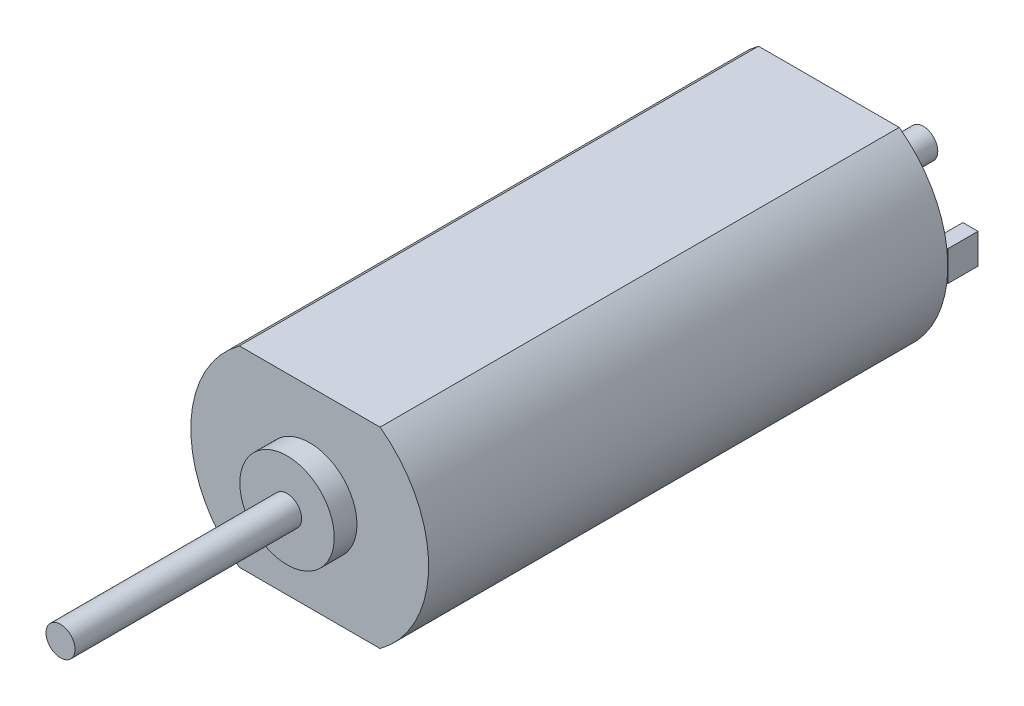
ISO-10303-21;
HEADER;
FILE_DESCRIPTION(('STEP AP214'),'2;1');
FILE_NAME('part.step','',(''),(''),'','','');
FILE_SCHEMA(('AUTOMOTIVE_DESIGN { 1 0 10303 214 1 1 1 1 }'));
ENDSEC;
DATA;
#1=APPLICATION_CONTEXT('core data for automotive mechanical design processes');
#2=APPLICATION_PROTOCOL_DEFINITION('international standard','automotive_design',2000,#1);
#3=PRODUCT_CONTEXT('',#1,'mechanical');
#4=PRODUCT('Part','Part','',(#3));
#5=PRODUCT_RELATED_PRODUCT_CATEGORY('part','',(#4));
#6=PRODUCT_DEFINITION_FORMATION('','',#4);
#7=PRODUCT_DEFINITION_CONTEXT('part definition',#1,'design');
#8=PRODUCT_DEFINITION('design','',#6,#7);
#9=PRODUCT_DEFINITION_SHAPE('','',#8);
#10=(LENGTH_UNIT() NAMED_UNIT(*) SI_UNIT(.MILLI.,.METRE.));
#11=(NAMED_UNIT(*) PLANE_ANGLE_UNIT() SI_UNIT($,.RADIAN.));
#12=(NAMED_UNIT(*) SI_UNIT($,.STERADIAN.) SOLID_ANGLE_UNIT());
#13=UNCERTAINTY_MEASURE_WITH_UNIT(LENGTH_MEASURE(1.E-05),#10,'distance_accuracy_value','');
#14=(GEOMETRIC_REPRESENTATION_CONTEXT(3) GLOBAL_UNCERTAINTY_ASSIGNED_CONTEXT((#13)) GLOBAL_UNIT_ASSIGNED_CONTEXT((#10,
#11,#12)) REPRESENTATION_CONTEXT('',''));
#15=CARTESIAN_POINT('',(0.,0.,0.));
#16=DIRECTION('',(0.,0.,1.));
#17=DIRECTION('',(1.,0.,0.));
#18=AXIS2_PLACEMENT_3D('',#15,#16,#17);
#19=CARTESIAN_POINT('',(0.,0.,0.));
#20=DIRECTION('',(0.,0.,1.));
#21=DIRECTION('',(1.,0.,0.));
#22=AXIS2_PLACEMENT_3D('',#19,#20,#21);
#23=PLANE('',#22);
#24=CARTESIAN_POINT('',(0.,0.,0.));
#25=DIRECTION('',(0.,0.,1.));
#26=DIRECTION('',(1.,0.,0.));
#27=AXIS2_PLACEMENT_3D('',#24,#25,#26);
#28=CIRCLE('',#27,0.9779);
#29=CARTESIAN_POINT('',(0.9779,0.,0.));
#30=VERTEX_POINT('',#29);
#31=EDGE_CURVE('E43',#30,#30,#28,.F.);
#32=ORIENTED_EDGE('',*,*,#31,.F.);
#33=EDGE_LOOP('',(#32));
#34=FACE_BOUND('',#33,.T.);
#35=DIRECTION('',(-1.,0.,0.));
#36=VECTOR('',#35,1.);
#37=CARTESIAN_POINT('',(-6.985,-1.016,0.));
#38=LINE('',#37,#36);
#39=CARTESIAN_POINT('',(-6.985,-1.016,0.));
#40=VERTEX_POINT('',#39);
#41=CARTESIAN_POINT('',(-7.93522173603233,-1.016,0.));
#42=VERTEX_POINT('',#41);
#43=EDGE_CURVE('E50',#40,#42,#38,.T.);
#44=ORIENTED_EDGE('',*,*,#43,.F.);
#45=DIRECTION('',(0.,-1.,0.));
#46=VECTOR('',#45,1.);
#47=CARTESIAN_POINT('',(-6.985,1.016,0.));
#48=LINE('',#47,#46);
#49=CARTESIAN_POINT('',(-6.985,1.016,0.));
#50=VERTEX_POINT('',#49);
#51=EDGE_CURVE('E157',#50,#40,#48,.T.);
#52=ORIENTED_EDGE('',*,*,#51,.F.);
#53=DIRECTION('',(1.,0.,0.));
#54=VECTOR('',#53,1.);
#55=CARTESIAN_POINT('',(-6.985,1.016,0.));
#56=LINE('',#55,#54);
#57=CARTESIAN_POINT('',(-7.93522173603233,1.016,0.));
#58=VERTEX_POINT('',#57);
#59=EDGE_CURVE('E254',#58,#50,#56,.T.);
#60=ORIENTED_EDGE('',*,*,#59,.F.);
#61=CARTESIAN_POINT('',(0.,0.,0.));
#62=DIRECTION('',(0.,0.,1.));
#63=DIRECTION('',(1.,0.,0.));
#64=AXIS2_PLACEMENT_3D('',#61,#62,#63);
#65=CIRCLE('',#64,8.);
#66=CARTESIAN_POINT('',(-4.73259970840552,6.45,0.));
#67=VERTEX_POINT('',#66);
#68=EDGE_CURVE('E224',#67,#58,#65,.T.);
#69=ORIENTED_EDGE('',*,*,#68,.F.);
#70=DIRECTION('',(1.,0.,0.));
#71=VECTOR('',#70,1.);
#72=CARTESIAN_POINT('',(0.,6.45,0.));
#73=LINE('',#72,#71);
#74=CARTESIAN_POINT('',(4.73259970840552,6.45,0.));
#75=VERTEX_POINT('',#74);
#76=EDGE_CURVE('E208',#67,#75,#73,.T.);
#77=ORIENTED_EDGE('',*,*,#76,.T.);
#78=CARTESIAN_POINT('',(7.93522173603233,1.016,0.));
#79=VERTEX_POINT('',#78);
#80=EDGE_CURVE('E231',#79,#75,#65,.T.);
#81=ORIENTED_EDGE('',*,*,#80,.F.);
#82=DIRECTION('',(1.,0.,0.));
#83=VECTOR('',#82,1.);
#84=CARTESIAN_POINT('',(8.001,1.016,0.));
#85=LINE('',#84,#83);
#86=CARTESIAN_POINT('',(6.985,1.016,0.));
#87=VERTEX_POINT('',#86);
#88=EDGE_CURVE('E171',#87,#79,#85,.T.);
#89=ORIENTED_EDGE('',*,*,#88,.F.);
#90=DIRECTION('',(0.,1.,0.));
#91=VECTOR('',#90,1.);
#92=CARTESIAN_POINT('',(6.985,1.016,0.));
#93=LINE('',#92,#91);
#94=CARTESIAN_POINT('',(6.985,-1.016,0.));
#95=VERTEX_POINT('',#94);
#96=EDGE_CURVE('E58',#95,#87,#93,.T.);
#97=ORIENTED_EDGE('',*,*,#96,.F.);
#98=DIRECTION('',(-1.,0.,0.));
#99=VECTOR('',#98,1.);
#100=CARTESIAN_POINT('',(0.,-1.016,0.));
#101=LINE('',#100,#99);
#102=CARTESIAN_POINT('',(7.93522173603233,-1.016,0.));
#103=VERTEX_POINT('',#102);
#104=EDGE_CURVE('E11',#103,#95,#101,.T.);
#105=ORIENTED_EDGE('',*,*,#104,.F.);
#106=CARTESIAN_POINT('',(4.73259970840552,-6.45,0.));
#107=VERTEX_POINT('',#106);
#108=EDGE_CURVE('E215',#107,#103,#65,.T.);
#109=ORIENTED_EDGE('',*,*,#108,.F.);
#110=DIRECTION('',(-1.,0.,0.));
#111=VECTOR('',#110,1.);
#112=CARTESIAN_POINT('',(0.,-6.45,0.));
#113=LINE('',#112,#111);
#114=CARTESIAN_POINT('',(-4.73259970840552,-6.45,0.));
#115=VERTEX_POINT('',#114);
#116=EDGE_CURVE('E227',#107,#115,#113,.T.);
#117=ORIENTED_EDGE('',*,*,#116,.T.);
#118=EDGE_CURVE('E223',#42,#115,#65,.T.);
#119=ORIENTED_EDGE('',*,*,#118,.F.);
#120=EDGE_LOOP('',(#44,#52,#60,#69,#77,#81,#89,#97,#105,#109,#117,#119));
#121=FACE_BOUND('',#120,.T.);
#122=ADVANCED_FACE('F35',(#34,#121),#23,.F.);
#123=CARTESIAN_POINT('',(0.,6.45,34.925));
#124=DIRECTION('',(0.,1.,0.));
#125=DIRECTION('',(0.,0.,1.));
#126=AXIS2_PLACEMENT_3D('',#123,#124,#125);
#127=PLANE('',#126);
#128=ORIENTED_EDGE('',*,*,#76,.F.);
#129=DIRECTION('',(0.,0.,-1.));
#130=VECTOR('',#129,1.);
#131=CARTESIAN_POINT('',(-4.73259970840552,6.45,34.925));
#132=LINE('',#131,#130);
#133=CARTESIAN_POINT('',(-4.73259970840552,6.45,34.925));
#134=VERTEX_POINT('',#133);
#135=EDGE_CURVE('E240',#134,#67,#132,.T.);
#136=ORIENTED_EDGE('',*,*,#135,.F.);
#137=DIRECTION('',(1.,0.,0.));
#138=VECTOR('',#137,1.);
#139=CARTESIAN_POINT('',(0.,6.45,34.925));
#140=LINE('',#139,#138);
#141=CARTESIAN_POINT('',(4.73259970840552,6.45,34.925));
#142=VERTEX_POINT('',#141);
#143=EDGE_CURVE('E211',#134,#142,#140,.T.);
#144=ORIENTED_EDGE('',*,*,#143,.T.);
#145=DIRECTION('',(0.,0.,-1.));
#146=VECTOR('',#145,1.);
#147=CARTESIAN_POINT('',(4.73259970840552,6.45,34.925));
#148=LINE('',#147,#146);
#149=EDGE_CURVE('E232',#142,#75,#148,.T.);
#150=ORIENTED_EDGE('',*,*,#149,.T.);
#151=EDGE_LOOP('',(#128,#136,#144,#150));
#152=FACE_BOUND('',#151,.T.);
#153=ADVANCED_FACE('F37',(#152),#127,.T.);
#154=CARTESIAN_POINT('',(0.,0.,34.925));
#155=DIRECTION('',(0.,0.,-1.));
#156=DIRECTION('',(-1.,0.,0.));
#157=AXIS2_PLACEMENT_3D('',#154,#155,#156);
#158=CYLINDRICAL_SURFACE('',#157,8.);
#159=ORIENTED_EDGE('',*,*,#68,.T.);
#160=EDGE_CURVE('E228',#58,#42,#65,.T.);
#161=ORIENTED_EDGE('',*,*,#160,.T.);
#162=ORIENTED_EDGE('',*,*,#118,.T.);
#163=DIRECTION('',(0.,0.,-1.));
#164=VECTOR('',#163,1.);
#165=CARTESIAN_POINT('',(-4.73259970840552,-6.45,34.925));
#166=LINE('',#165,#164);
#167=CARTESIAN_POINT('',(-4.73259970840552,-6.45,34.925));
#168=VERTEX_POINT('',#167);
#169=EDGE_CURVE('E237',#168,#115,#166,.T.);
#170=ORIENTED_EDGE('',*,*,#169,.F.);
#171=CARTESIAN_POINT('',(0.,0.,34.925));
#172=DIRECTION('',(0.,0.,1.));
#173=DIRECTION('',(1.,0.,0.));
#174=AXIS2_PLACEMENT_3D('',#171,#172,#173);
#175=CIRCLE('',#174,8.);
#176=EDGE_CURVE('E214',#134,#168,#175,.T.);
#177=ORIENTED_EDGE('',*,*,#176,.F.);
#178=ORIENTED_EDGE('',*,*,#135,.T.);
#179=EDGE_LOOP('',(#159,#161,#162,#170,#177,#178));
#180=FACE_BOUND('',#179,.T.);
#181=ADVANCED_FACE('F349',(#180),#158,.T.);
#182=CARTESIAN_POINT('',(0.,-6.45,34.925));
#183=DIRECTION('',(0.,-1.,0.));
#184=DIRECTION('',(0.,0.,-1.));
#185=AXIS2_PLACEMENT_3D('',#182,#183,#184);
#186=PLANE('',#185);
#187=ORIENTED_EDGE('',*,*,#116,.F.);
#188=DIRECTION('',(0.,0.,-1.));
#189=VECTOR('',#188,1.);
#190=CARTESIAN_POINT('',(4.73259970840552,-6.45,34.925));
#191=LINE('',#190,#189);
#192=CARTESIAN_POINT('',(4.73259970840552,-6.45,34.925));
#193=VERTEX_POINT('',#192);
#194=EDGE_CURVE('E235',#193,#107,#191,.T.);
#195=ORIENTED_EDGE('',*,*,#194,.F.);
#196=DIRECTION('',(-1.,0.,0.));
#197=VECTOR('',#196,1.);
#198=CARTESIAN_POINT('',(0.,-6.45,34.925));
#199=LINE('',#198,#197);
#200=EDGE_CURVE('E217',#193,#168,#199,.T.);
#201=ORIENTED_EDGE('',*,*,#200,.T.);
#202=ORIENTED_EDGE('',*,*,#169,.T.);
#203=EDGE_LOOP('',(#187,#195,#201,#202));
#204=FACE_BOUND('',#203,.T.);
#205=ADVANCED_FACE('F348',(#204),#186,.T.);
#206=ORIENTED_EDGE('',*,*,#108,.T.);
#207=EDGE_CURVE('E272',#103,#79,#65,.T.);
#208=ORIENTED_EDGE('',*,*,#207,.T.);
#209=ORIENTED_EDGE('',*,*,#80,.T.);
#210=ORIENTED_EDGE('',*,*,#149,.F.);
#211=EDGE_CURVE('E218',#193,#142,#175,.T.);
#212=ORIENTED_EDGE('',*,*,#211,.F.);
#213=ORIENTED_EDGE('',*,*,#194,.T.);
#214=EDGE_LOOP('',(#206,#208,#209,#210,#212,#213));
#215=FACE_BOUND('',#214,.T.);
#216=ADVANCED_FACE('F279',(#215),#158,.T.);
#217=CARTESIAN_POINT('',(0.,0.,34.925));
#218=DIRECTION('',(0.,0.,1.));
#219=DIRECTION('',(1.,0.,0.));
#220=AXIS2_PLACEMENT_3D('',#217,#218,#219);
#221=PLANE('',#220);
#222=CARTESIAN_POINT('',(0.,0.,34.925));
#223=DIRECTION('',(0.,0.,1.));
#224=DIRECTION('',(1.,0.,0.));
#225=AXIS2_PLACEMENT_3D('',#222,#223,#224);
#226=CIRCLE('',#225,3.175);
#227=CARTESIAN_POINT('',(-3.175,0.,34.925));
#228=VERTEX_POINT('',#227);
#229=EDGE_CURVE('E202',#228,#228,#226,.T.);
#230=ORIENTED_EDGE('',*,*,#229,.F.);
#231=EDGE_LOOP('',(#230));
#232=FACE_BOUND('',#231,.T.);
#233=ORIENTED_EDGE('',*,*,#143,.F.);
#234=ORIENTED_EDGE('',*,*,#176,.T.);
#235=ORIENTED_EDGE('',*,*,#200,.F.);
#236=ORIENTED_EDGE('',*,*,#211,.T.);
#237=EDGE_LOOP('',(#233,#234,#235,#236));
#238=FACE_BOUND('',#237,.T.);
#239=ADVANCED_FACE('F342',(#232,#238),#221,.T.);
#240=CARTESIAN_POINT('',(0.,0.,36.449));
#241=DIRECTION('',(0.,0.,-1.));
#242=DIRECTION('',(-1.,0.,0.));
#243=AXIS2_PLACEMENT_3D('',#240,#241,#242);
#244=CYLINDRICAL_SURFACE('',#243,3.175);
#245=CARTESIAN_POINT('',(0.,0.,36.449));
#246=DIRECTION('',(0.,0.,1.));
#247=DIRECTION('',(1.,0.,0.));
#248=AXIS2_PLACEMENT_3D('',#245,#246,#247);
#249=CIRCLE('',#248,3.175);
#250=CARTESIAN_POINT('',(-3.175,0.,36.449));
#251=VERTEX_POINT('',#250);
#252=EDGE_CURVE('E205',#251,#251,#249,.T.);
#253=CARTESIAN_POINT('',(-3.175,0.,36.449));
#254=CARTESIAN_POINT('',(-3.175,0.,36.433125));
#255=CARTESIAN_POINT('',(-3.175,0.,36.41725));
#256=CARTESIAN_POINT('',(-3.175,0.,36.3855));
#257=CARTESIAN_POINT('',(-3.175,0.,36.369625));
#258=CARTESIAN_POINT('',(-3.175,0.,36.337875));
#259=CARTESIAN_POINT('',(-3.175,0.,36.322));
#260=CARTESIAN_POINT('',(-3.175,0.,36.29025));
#261=CARTESIAN_POINT('',(-3.175,0.,36.274375));
#262=CARTESIAN_POINT('',(-3.175,0.,36.242625));
#263=CARTESIAN_POINT('',(-3.175,0.,36.22675));
#264=CARTESIAN_POINT('',(-3.175,0.,36.195));
#265=CARTESIAN_POINT('',(-3.175,0.,36.179125));
#266=CARTESIAN_POINT('',(-3.175,0.,36.147375));
#267=CARTESIAN_POINT('',(-3.175,0.,36.1315));
#268=CARTESIAN_POINT('',(-3.175,0.,36.09975));
#269=CARTESIAN_POINT('',(-3.175,0.,36.083875));
#270=CARTESIAN_POINT('',(-3.175,0.,36.052125));
#271=CARTESIAN_POINT('',(-3.175,0.,36.03625));
#272=CARTESIAN_POINT('',(-3.175,0.,36.0045));
#273=CARTESIAN_POINT('',(-3.175,0.,35.988625));
#274=CARTESIAN_POINT('',(-3.175,0.,35.956875));
#275=CARTESIAN_POINT('',(-3.175,0.,35.941));
#276=CARTESIAN_POINT('',(-3.175,0.,35.90925));
#277=CARTESIAN_POINT('',(-3.175,0.,35.893375));
#278=CARTESIAN_POINT('',(-3.175,0.,35.861625));
#279=CARTESIAN_POINT('',(-3.175,0.,35.84575));
#280=CARTESIAN_POINT('',(-3.175,0.,35.814));
#281=CARTESIAN_POINT('',(-3.175,0.,35.798125));
#282=CARTESIAN_POINT('',(-3.175,0.,35.766375));
#283=CARTESIAN_POINT('',(-3.175,0.,35.7505));
#284=CARTESIAN_POINT('',(-3.175,0.,35.71875));
#285=CARTESIAN_POINT('',(-3.175,0.,35.702875));
#286=CARTESIAN_POINT('',(-3.175,0.,35.671125));
#287=CARTESIAN_POINT('',(-3.175,0.,35.65525));
#288=CARTESIAN_POINT('',(-3.175,0.,35.6235));
#289=CARTESIAN_POINT('',(-3.175,0.,35.607625));
#290=CARTESIAN_POINT('',(-3.175,0.,35.575875));
#291=CARTESIAN_POINT('',(-3.175,0.,35.56));
#292=CARTESIAN_POINT('',(-3.175,0.,35.52825));
#293=CARTESIAN_POINT('',(-3.175,0.,35.512375));
#294=CARTESIAN_POINT('',(-3.175,0.,35.480625));
#295=CARTESIAN_POINT('',(-3.175,0.,35.46475));
#296=CARTESIAN_POINT('',(-3.175,0.,35.433));
#297=CARTESIAN_POINT('',(-3.175,0.,35.417125));
#298=CARTESIAN_POINT('',(-3.175,0.,35.385375));
#299=CARTESIAN_POINT('',(-3.175,0.,35.3695));
#300=CARTESIAN_POINT('',(-3.175,0.,35.33775));
#301=CARTESIAN_POINT('',(-3.175,0.,35.321875));
#302=CARTESIAN_POINT('',(-3.175,0.,35.290125));
#303=CARTESIAN_POINT('',(-3.175,0.,35.27425));
#304=CARTESIAN_POINT('',(-3.175,0.,35.2425));
#305=CARTESIAN_POINT('',(-3.175,0.,35.226625));
#306=CARTESIAN_POINT('',(-3.175,0.,35.194875));
#307=CARTESIAN_POINT('',(-3.175,0.,35.179));
#308=CARTESIAN_POINT('',(-3.175,0.,35.14725));
#309=CARTESIAN_POINT('',(-3.175,0.,35.131375));
#310=CARTESIAN_POINT('',(-3.175,0.,35.099625));
#311=CARTESIAN_POINT('',(-3.175,0.,35.08375));
#312=CARTESIAN_POINT('',(-3.175,0.,35.052));
#313=CARTESIAN_POINT('',(-3.175,0.,35.036125));
#314=CARTESIAN_POINT('',(-3.175,0.,35.004375));
#315=CARTESIAN_POINT('',(-3.175,0.,34.9885));
#316=CARTESIAN_POINT('',(-3.175,0.,34.95675));
#317=CARTESIAN_POINT('',(-3.175,0.,34.940875));
#318=CARTESIAN_POINT('',(-3.175,0.,34.925));
#319=B_SPLINE_CURVE_WITH_KNOTS('',3,(#253,#254,#255,#256,#257,#258,#259,#260,#261,#262,#263,
#264,#265,#266,#267,#268,#269,#270,#271,#272,#273,#274,#275,#276,#277,#278,#279,#280,#281,#282,
#283,#284,#285,#286,#287,#288,#289,#290,#291,#292,#293,#294,#295,#296,#297,#298,#299,#300,#301,
#302,#303,#304,#305,#306,#307,#308,#309,#310,#311,#312,#313,#314,#315,#316,#317,#318),
.UNSPECIFIED.,.F.,.F.,(4,2,2,2,2,2,2,2,2,2,2,2,2,2,2,2,2,2,2,2,2,2,2,2,2,2,2,2,2,2,2,2,4),(0.,
0.0476249999999956,0.0952499999999981,0.142874999999994,0.190499999999996,0.238124999999999,
0.285749999999994,0.333374999999997,0.380999999999999,0.428624999999995,0.476249999999998,
0.523874999999993,0.571499999999996,0.619124999999998,0.666749999999994,0.714374999999996,
0.761999999999999,0.809624999999994,0.857249999999997,0.904874999999993,0.952499999999995,
1.000125,1.04774999999999,1.095375,1.143,1.19062499999999,1.23825,1.28587499999999,
1.33349999999999,1.381125,1.42874999999999,1.476375,1.524),.UNSPECIFIED.);
#320=EDGE_CURVE('BSEAM338',#251,#228,#319,.T.);
#321=ORIENTED_EDGE('',*,*,#252,.F.);
#322=ORIENTED_EDGE('',*,*,#229,.T.);
#323=ORIENTED_EDGE('',*,*,#320,.T.);
#324=ORIENTED_EDGE('',*,*,#320,.F.);
#325=EDGE_LOOP('',(#321,#323,#322,#324));
#326=FACE_BOUND('',#325,.T.);
#327=ADVANCED_FACE('F338',(#326),#244,.T.);
#328=CARTESIAN_POINT('',(0.,0.,36.449));
#329=DIRECTION('',(0.,0.,1.));
#330=DIRECTION('',(1.,0.,0.));
#331=AXIS2_PLACEMENT_3D('',#328,#329,#330);
#332=PLANE('',#331);
#333=CARTESIAN_POINT('',(0.,0.,36.449));
#334=DIRECTION('',(0.,0.,1.));
#335=DIRECTION('',(1.,0.,0.));
#336=AXIS2_PLACEMENT_3D('',#333,#334,#335);
#337=CIRCLE('',#336,0.9779);
#338=CARTESIAN_POINT('',(-0.9779,0.,36.449));
#339=VERTEX_POINT('',#338);
#340=EDGE_CURVE('E198',#339,#339,#337,.T.);
#341=ORIENTED_EDGE('',*,*,#340,.F.);
#342=EDGE_LOOP('',(#341));
#343=FACE_BOUND('',#342,.T.);
#344=ORIENTED_EDGE('',*,*,#252,.T.);
#345=EDGE_LOOP('',(#344));
#346=FACE_BOUND('',#345,.T.);
#347=ADVANCED_FACE('F334',(#343,#346),#332,.T.);
#348=CARTESIAN_POINT('',(0.,0.,51.689));
#349=DIRECTION('',(0.,0.,-1.));
#350=DIRECTION('',(-1.,0.,0.));
#351=AXIS2_PLACEMENT_3D('',#348,#349,#350);
#352=CYLINDRICAL_SURFACE('',#351,0.9779);
#353=CARTESIAN_POINT('',(0.,0.,51.689));
#354=DIRECTION('',(0.,0.,1.));
#355=DIRECTION('',(1.,0.,0.));
#356=AXIS2_PLACEMENT_3D('',#353,#354,#355);
#357=CIRCLE('',#356,0.9779);
#358=CARTESIAN_POINT('',(-0.9779,0.,51.689));
#359=VERTEX_POINT('',#358);
#360=EDGE_CURVE('E199',#359,#359,#357,.T.);
#361=CARTESIAN_POINT('',(-0.9779,0.,51.689));
#362=CARTESIAN_POINT('',(-0.9779,0.,51.53025));
#363=CARTESIAN_POINT('',(-0.9779,0.,51.3715));
#364=CARTESIAN_POINT('',(-0.9779,0.,51.054));
#365=CARTESIAN_POINT('',(-0.9779,0.,50.89525));
#366=CARTESIAN_POINT('',(-0.9779,0.,50.57775));
#367=CARTESIAN_POINT('',(-0.9779,0.,50.419));
#368=CARTESIAN_POINT('',(-0.9779,0.,50.1015));
#369=CARTESIAN_POINT('',(-0.9779,0.,49.94275));
#370=CARTESIAN_POINT('',(-0.9779,0.,49.62525));
#371=CARTESIAN_POINT('',(-0.9779,0.,49.4665));
#372=CARTESIAN_POINT('',(-0.9779,0.,49.149));
#373=CARTESIAN_POINT('',(-0.9779,0.,48.99025));
#374=CARTESIAN_POINT('',(-0.9779,0.,48.67275));
#375=CARTESIAN_POINT('',(-0.9779,0.,48.514));
#376=CARTESIAN_POINT('',(-0.9779,0.,48.1965));
#377=CARTESIAN_POINT('',(-0.9779,0.,48.03775));
#378=CARTESIAN_POINT('',(-0.9779,0.,47.72025));
#379=CARTESIAN_POINT('',(-0.9779,0.,47.5615));
#380=CARTESIAN_POINT('',(-0.9779,0.,47.244));
#381=CARTESIAN_POINT('',(-0.9779,0.,47.08525));
#382=CARTESIAN_POINT('',(-0.9779,0.,46.76775));
#383=CARTESIAN_POINT('',(-0.9779,0.,46.609));
#384=CARTESIAN_POINT('',(-0.9779,0.,46.2915));
#385=CARTESIAN_POINT('',(-0.9779,0.,46.13275));
#386=CARTESIAN_POINT('',(-0.9779,0.,45.81525));
#387=CARTESIAN_POINT('',(-0.9779,0.,45.6565));
#388=CARTESIAN_POINT('',(-0.9779,0.,45.339));
#389=CARTESIAN_POINT('',(-0.9779,0.,45.18025));
#390=CARTESIAN_POINT('',(-0.9779,0.,44.86275));
#391=CARTESIAN_POINT('',(-0.9779,0.,44.704));
#392=CARTESIAN_POINT('',(-0.9779,0.,44.3865));
#393=CARTESIAN_POINT('',(-0.9779,0.,44.22775));
#394=CARTESIAN_POINT('',(-0.9779,0.,43.91025));
#395=CARTESIAN_POINT('',(-0.9779,0.,43.7515));
#396=CARTESIAN_POINT('',(-0.9779,0.,43.434));
#397=CARTESIAN_POINT('',(-0.9779,0.,43.27525));
#398=CARTESIAN_POINT('',(-0.9779,0.,42.95775));
#399=CARTESIAN_POINT('',(-0.9779,0.,42.799));
#400=CARTESIAN_POINT('',(-0.9779,0.,42.4815));
#401=CARTESIAN_POINT('',(-0.9779,0.,42.32275));
#402=CARTESIAN_POINT('',(-0.9779,0.,42.00525));
#403=CARTESIAN_POINT('',(-0.9779,0.,41.8465));
#404=CARTESIAN_POINT('',(-0.9779,0.,41.529));
#405=CARTESIAN_POINT('',(-0.9779,0.,41.37025));
#406=CARTESIAN_POINT('',(-0.9779,0.,41.05275));
#407=CARTESIAN_POINT('',(-0.9779,0.,40.894));
#408=CARTESIAN_POINT('',(-0.9779,0.,40.5765));
#409=CARTESIAN_POINT('',(-0.9779,0.,40.41775));
#410=CARTESIAN_POINT('',(-0.9779,0.,40.10025));
#411=CARTESIAN_POINT('',(-0.9779,0.,39.9415));
#412=CARTESIAN_POINT('',(-0.9779,0.,39.624));
#413=CARTESIAN_POINT('',(-0.9779,0.,39.46525));
#414=CARTESIAN_POINT('',(-0.9779,0.,39.14775));
#415=CARTESIAN_POINT('',(-0.9779,0.,38.989));
#416=CARTESIAN_POINT('',(-0.9779,0.,38.6715));
#417=CARTESIAN_POINT('',(-0.9779,0.,38.51275));
#418=CARTESIAN_POINT('',(-0.9779,0.,38.19525));
#419=CARTESIAN_POINT('',(-0.9779,0.,38.0365));
#420=CARTESIAN_POINT('',(-0.9779,0.,37.719));
#421=CARTESIAN_POINT('',(-0.9779,0.,37.56025));
#422=CARTESIAN_POINT('',(-0.9779,0.,37.24275));
#423=CARTESIAN_POINT('',(-0.9779,0.,37.084));
#424=CARTESIAN_POINT('',(-0.9779,0.,36.7665));
#425=CARTESIAN_POINT('',(-0.9779,0.,36.60775));
#426=CARTESIAN_POINT('',(-0.9779,0.,36.449));
#427=B_SPLINE_CURVE_WITH_KNOTS('',3,(#361,#362,#363,#364,#365,#366,#367,#368,#369,#370,#371,
#372,#373,#374,#375,#376,#377,#378,#379,#380,#381,#382,#383,#384,#385,#386,#387,#388,#389,#390,
#391,#392,#393,#394,#395,#396,#397,#398,#399,#400,#401,#402,#403,#404,#405,#406,#407,#408,#409,
#410,#411,#412,#413,#414,#415,#416,#417,#418,#419,#420,#421,#422,#423,#424,#425,#426),
.UNSPECIFIED.,.F.,.F.,(4,2,2,2,2,2,2,2,2,2,2,2,2,2,2,2,2,2,2,2,2,2,2,2,2,2,2,2,2,2,2,2,4),(0.,
0.476249999999998,0.952499999999995,1.42875,1.905,2.38124999999999,2.8575,3.33375,
3.80999999999999,4.28625,4.7625,5.23874999999999,5.715,6.19125,6.66749999999999,7.14375,
7.61999999999999,8.09624999999999,8.5725,9.04874999999999,9.52499999999999,10.00125,10.4775,
10.95375,11.43,11.90625,12.3825,12.85875,13.335,13.81125,14.2875,14.76375,15.24),.UNSPECIFIED.);
#428=EDGE_CURVE('BSEAM330',#359,#339,#427,.T.);
#429=ORIENTED_EDGE('',*,*,#360,.F.);
#430=ORIENTED_EDGE('',*,*,#340,.T.);
#431=ORIENTED_EDGE('',*,*,#428,.T.);
#432=ORIENTED_EDGE('',*,*,#428,.F.);
#433=EDGE_LOOP('',(#429,#431,#430,#432));
#434=FACE_BOUND('',#433,.T.);
#435=ADVANCED_FACE('F330',(#434),#352,.T.);
#436=CARTESIAN_POINT('',(0.,0.,51.689));
#437=DIRECTION('',(0.,0.,1.));
#438=DIRECTION('',(1.,0.,0.));
#439=AXIS2_PLACEMENT_3D('',#436,#437,#438);
#440=PLANE('',#439);
#441=ORIENTED_EDGE('',*,*,#360,.T.);
#442=EDGE_LOOP('',(#441));
#443=FACE_BOUND('',#442,.T.);
#444=ADVANCED_FACE('F326',(#443),#440,.T.);
#445=CARTESIAN_POINT('',(0.,0.,-6.35));
#446=DIRECTION('',(0.,0.,1.));
#447=DIRECTION('',(1.,0.,0.));
#448=AXIS2_PLACEMENT_3D('',#445,#446,#447);
#449=CYLINDRICAL_SURFACE('',#448,0.9779);
#450=CARTESIAN_POINT('',(0.,0.,-6.35));
#451=DIRECTION('',(0.,0.,-1.));
#452=DIRECTION('',(-1.,0.,0.));
#453=AXIS2_PLACEMENT_3D('',#450,#451,#452);
#454=CIRCLE('',#453,0.9779);
#455=CARTESIAN_POINT('',(-0.9779,0.,-6.35));
#456=VERTEX_POINT('',#455);
#457=EDGE_CURVE('E195',#456,#456,#454,.T.);
#458=ORIENTED_EDGE('',*,*,#457,.F.);
#459=EDGE_LOOP('',(#458));
#460=FACE_BOUND('',#459,.T.);
#461=ORIENTED_EDGE('',*,*,#31,.T.);
#462=EDGE_LOOP('',(#461));
#463=FACE_BOUND('',#462,.T.);
#464=ADVANCED_FACE('F244',(#460,#463),#449,.T.);
#465=CARTESIAN_POINT('',(0.,0.,-6.35));
#466=DIRECTION('',(0.,0.,-1.));
#467=DIRECTION('',(-1.,0.,0.));
#468=AXIS2_PLACEMENT_3D('',#465,#466,#467);
#469=PLANE('',#468);
#470=ORIENTED_EDGE('',*,*,#457,.T.);
#471=EDGE_LOOP('',(#470));
#472=FACE_BOUND('',#471,.T.);
#473=ADVANCED_FACE('F320',(#472),#469,.T.);
#474=CARTESIAN_POINT('',(8.001,1.016,-2.032));
#475=DIRECTION('',(-1.,0.,0.));
#476=DIRECTION('',(0.,0.,1.));
#477=AXIS2_PLACEMENT_3D('',#474,#475,#476);
#478=PLANE('',#477);
#479=DIRECTION('',(0.,-1.,0.));
#480=VECTOR('',#479,1.);
#481=CARTESIAN_POINT('',(8.001,1.016,0.));
#482=LINE('',#481,#480);
#483=CARTESIAN_POINT('',(8.001,1.016,0.));
#484=VERTEX_POINT('',#483);
#485=CARTESIAN_POINT('',(8.001,-1.016,0.));
#486=VERTEX_POINT('',#485);
#487=EDGE_CURVE('E158',#484,#486,#482,.T.);
#488=ORIENTED_EDGE('',*,*,#487,.T.);
#489=DIRECTION('',(0.,0.,1.));
#490=VECTOR('',#489,1.);
#491=CARTESIAN_POINT('',(8.001,-1.016,-2.032));
#492=LINE('',#491,#490);
#493=CARTESIAN_POINT('',(8.001,-1.016,-2.032));
#494=VERTEX_POINT('',#493);
#495=EDGE_CURVE('E192',#494,#486,#492,.T.);
#496=ORIENTED_EDGE('',*,*,#495,.F.);
#497=DIRECTION('',(0.,-1.,0.));
#498=VECTOR('',#497,1.);
#499=CARTESIAN_POINT('',(8.001,1.016,-2.032));
#500=LINE('',#499,#498);
#501=CARTESIAN_POINT('',(8.001,1.016,-2.032));
#502=VERTEX_POINT('',#501);
#503=EDGE_CURVE('E167',#502,#494,#500,.T.);
#504=ORIENTED_EDGE('',*,*,#503,.F.);
#505=DIRECTION('',(0.,0.,1.));
#506=VECTOR('',#505,1.);
#507=CARTESIAN_POINT('',(8.001,1.016,-2.032));
#508=LINE('',#507,#506);
#509=EDGE_CURVE('E176',#502,#484,#508,.T.);
#510=ORIENTED_EDGE('',*,*,#509,.T.);
#511=EDGE_LOOP('',(#488,#496,#504,#510));
#512=FACE_BOUND('',#511,.T.);
#513=ADVANCED_FACE('F292',(#512),#478,.F.);
#514=CARTESIAN_POINT('',(8.001,-1.016,-2.032));
#515=DIRECTION('',(0.,1.,0.));
#516=DIRECTION('',(0.,0.,1.));
#517=AXIS2_PLACEMENT_3D('',#514,#515,#516);
#518=PLANE('',#517);
#519=DIRECTION('',(-1.,0.,0.));
#520=VECTOR('',#519,1.);
#521=CARTESIAN_POINT('',(8.001,-1.016,0.));
#522=LINE('',#521,#520);
#523=EDGE_CURVE('E161',#486,#103,#522,.T.);
#524=ORIENTED_EDGE('',*,*,#523,.T.);
#525=ORIENTED_EDGE('',*,*,#104,.T.);
#526=DIRECTION('',(0.,0.,1.));
#527=VECTOR('',#526,1.);
#528=CARTESIAN_POINT('',(6.985,-1.016,-2.032));
#529=LINE('',#528,#527);
#530=CARTESIAN_POINT('',(6.985,-1.016,-2.032));
#531=VERTEX_POINT('',#530);
#532=EDGE_CURVE('E189',#531,#95,#529,.T.);
#533=ORIENTED_EDGE('',*,*,#532,.F.);
#534=DIRECTION('',(-1.,0.,0.));
#535=VECTOR('',#534,1.);
#536=CARTESIAN_POINT('',(8.001,-1.016,-2.032));
#537=LINE('',#536,#535);
#538=EDGE_CURVE('E170',#494,#531,#537,.T.);
#539=ORIENTED_EDGE('',*,*,#538,.F.);
#540=ORIENTED_EDGE('',*,*,#495,.T.);
#541=EDGE_LOOP('',(#524,#525,#533,#539,#540));
#542=FACE_BOUND('',#541,.T.);
#543=ADVANCED_FACE('F287',(#542),#518,.F.);
#544=CARTESIAN_POINT('',(6.985,1.016,-2.032));
#545=DIRECTION('',(1.,0.,0.));
#546=DIRECTION('',(0.,0.,-1.));
#547=AXIS2_PLACEMENT_3D('',#544,#545,#546);
#548=PLANE('',#547);
#549=ORIENTED_EDGE('',*,*,#96,.T.);
#550=DIRECTION('',(0.,0.,1.));
#551=VECTOR('',#550,1.);
#552=CARTESIAN_POINT('',(6.985,1.016,-2.032));
#553=LINE('',#552,#551);
#554=CARTESIAN_POINT('',(6.985,1.016,-2.032));
#555=VERTEX_POINT('',#554);
#556=EDGE_CURVE('E186',#555,#87,#553,.T.);
#557=ORIENTED_EDGE('',*,*,#556,.F.);
#558=DIRECTION('',(0.,1.,0.));
#559=VECTOR('',#558,1.);
#560=CARTESIAN_POINT('',(6.985,1.016,-2.032));
#561=LINE('',#560,#559);
#562=EDGE_CURVE('E173',#531,#555,#561,.T.);
#563=ORIENTED_EDGE('',*,*,#562,.F.);
#564=ORIENTED_EDGE('',*,*,#532,.T.);
#565=EDGE_LOOP('',(#549,#557,#563,#564));
#566=FACE_BOUND('',#565,.T.);
#567=ADVANCED_FACE('F299',(#566),#548,.F.);
#568=CARTESIAN_POINT('',(8.001,1.016,-2.032));
#569=DIRECTION('',(0.,-1.,0.));
#570=DIRECTION('',(0.,0.,-1.));
#571=AXIS2_PLACEMENT_3D('',#568,#569,#570);
#572=PLANE('',#571);
#573=ORIENTED_EDGE('',*,*,#88,.T.);
#574=EDGE_CURVE('E181',#79,#484,#85,.T.);
#575=ORIENTED_EDGE('',*,*,#574,.T.);
#576=ORIENTED_EDGE('',*,*,#509,.F.);
#577=DIRECTION('',(1.,0.,0.));
#578=VECTOR('',#577,1.);
#579=CARTESIAN_POINT('',(8.001,1.016,-2.032));
#580=LINE('',#579,#578);
#581=EDGE_CURVE('E175',#555,#502,#580,.T.);
#582=ORIENTED_EDGE('',*,*,#581,.F.);
#583=ORIENTED_EDGE('',*,*,#556,.T.);
#584=EDGE_LOOP('',(#573,#575,#576,#582,#583));
#585=FACE_BOUND('',#584,.T.);
#586=ADVANCED_FACE('F296',(#585),#572,.F.);
#587=CARTESIAN_POINT('',(0.,0.,-2.032));
#588=DIRECTION('',(0.,0.,-1.));
#589=DIRECTION('',(-1.,0.,0.));
#590=AXIS2_PLACEMENT_3D('',#587,#588,#589);
#591=PLANE('',#590);
#592=ORIENTED_EDGE('',*,*,#503,.T.);
#593=ORIENTED_EDGE('',*,*,#538,.T.);
#594=ORIENTED_EDGE('',*,*,#562,.T.);
#595=ORIENTED_EDGE('',*,*,#581,.T.);
#596=EDGE_LOOP('',(#592,#593,#594,#595));
#597=FACE_BOUND('',#596,.T.);
#598=ADVANCED_FACE('F302',(#597),#591,.T.);
#599=CARTESIAN_POINT('',(0.,0.,0.));
#600=DIRECTION('',(0.,0.,-1.));
#601=DIRECTION('',(-1.,0.,0.));
#602=AXIS2_PLACEMENT_3D('',#599,#600,#601);
#603=PLANE('',#602);
#604=ORIENTED_EDGE('',*,*,#574,.F.);
#605=ORIENTED_EDGE('',*,*,#207,.F.);
#606=ORIENTED_EDGE('',*,*,#523,.F.);
#607=ORIENTED_EDGE('',*,*,#487,.F.);
#608=EDGE_LOOP('',(#604,#605,#606,#607));
#609=FACE_BOUND('',#608,.T.);
#610=ADVANCED_FACE('F284',(#609),#603,.F.);
#611=CARTESIAN_POINT('',(-6.985,1.016,-2.032));
#612=DIRECTION('',(-1.,0.,0.));
#613=DIRECTION('',(0.,0.,1.));
#614=AXIS2_PLACEMENT_3D('',#611,#612,#613);
#615=PLANE('',#614);
#616=ORIENTED_EDGE('',*,*,#51,.T.);
#617=DIRECTION('',(0.,0.,1.));
#618=VECTOR('',#617,1.);
#619=CARTESIAN_POINT('',(-6.985,-1.016,-2.032));
#620=LINE('',#619,#618);
#621=CARTESIAN_POINT('',(-6.985,-1.016,-2.032));
#622=VERTEX_POINT('',#621);
#623=EDGE_CURVE('E137',#622,#40,#620,.T.);
#624=ORIENTED_EDGE('',*,*,#623,.F.);
#625=DIRECTION('',(0.,-1.,0.));
#626=VECTOR('',#625,1.);
#627=CARTESIAN_POINT('',(-6.985,1.016,-2.032));
#628=LINE('',#627,#626);
#629=CARTESIAN_POINT('',(-6.985,1.016,-2.032));
#630=VERTEX_POINT('',#629);
#631=EDGE_CURVE('E144',#630,#622,#628,.T.);
#632=ORIENTED_EDGE('',*,*,#631,.F.);
#633=DIRECTION('',(0.,0.,1.));
#634=VECTOR('',#633,1.);
#635=CARTESIAN_POINT('',(-6.985,1.016,-2.032));
#636=LINE('',#635,#634);
#637=EDGE_CURVE('E261',#630,#50,#636,.T.);
#638=ORIENTED_EDGE('',*,*,#637,.T.);
#639=EDGE_LOOP('',(#616,#624,#632,#638));
#640=FACE_BOUND('',#639,.T.);
#641=ADVANCED_FACE('F155',(#640),#615,.F.);
#642=CARTESIAN_POINT('',(-6.985,-1.016,-2.032));
#643=DIRECTION('',(0.,1.,0.));
#644=DIRECTION('',(0.,0.,1.));
#645=AXIS2_PLACEMENT_3D('',#642,#643,#644);
#646=PLANE('',#645);
#647=ORIENTED_EDGE('',*,*,#43,.T.);
#648=CARTESIAN_POINT('',(-8.001,-1.016,0.));
#649=VERTEX_POINT('',#648);
#650=EDGE_CURVE('E252',#42,#649,#38,.T.);
#651=ORIENTED_EDGE('',*,*,#650,.T.);
#652=DIRECTION('',(0.,0.,1.));
#653=VECTOR('',#652,1.);
#654=CARTESIAN_POINT('',(-8.001,-1.016,-2.032));
#655=LINE('',#654,#653);
#656=CARTESIAN_POINT('',(-8.001,-1.016,-2.032));
#657=VERTEX_POINT('',#656);
#658=EDGE_CURVE('E140',#657,#649,#655,.T.);
#659=ORIENTED_EDGE('',*,*,#658,.F.);
#660=DIRECTION('',(-1.,0.,0.));
#661=VECTOR('',#660,1.);
#662=CARTESIAN_POINT('',(-6.985,-1.016,-2.032));
#663=LINE('',#662,#661);
#664=EDGE_CURVE('E133',#622,#657,#663,.T.);
#665=ORIENTED_EDGE('',*,*,#664,.F.);
#666=ORIENTED_EDGE('',*,*,#623,.T.);
#667=EDGE_LOOP('',(#647,#651,#659,#665,#666));
#668=FACE_BOUND('',#667,.T.);
#669=ADVANCED_FACE('F135',(#668),#646,.F.);
#670=CARTESIAN_POINT('',(-8.001,1.016,-2.032));
#671=DIRECTION('',(1.,0.,0.));
#672=DIRECTION('',(0.,0.,-1.));
#673=AXIS2_PLACEMENT_3D('',#670,#671,#672);
#674=PLANE('',#673);
#675=DIRECTION('',(0.,1.,0.));
#676=VECTOR('',#675,1.);
#677=CARTESIAN_POINT('',(-8.001,1.016,0.));
#678=LINE('',#677,#676);
#679=CARTESIAN_POINT('',(-8.001,1.016,0.));
#680=VERTEX_POINT('',#679);
#681=EDGE_CURVE('E251',#649,#680,#678,.T.);
#682=ORIENTED_EDGE('',*,*,#681,.T.);
#683=DIRECTION('',(0.,0.,1.));
#684=VECTOR('',#683,1.);
#685=CARTESIAN_POINT('',(-8.001,1.016,-2.032));
#686=LINE('',#685,#684);
#687=CARTESIAN_POINT('',(-8.001,1.016,-2.032));
#688=VERTEX_POINT('',#687);
#689=EDGE_CURVE('E163',#688,#680,#686,.T.);
#690=ORIENTED_EDGE('',*,*,#689,.F.);
#691=DIRECTION('',(0.,1.,0.));
#692=VECTOR('',#691,1.);
#693=CARTESIAN_POINT('',(-8.001,1.016,-2.032));
#694=LINE('',#693,#692);
#695=EDGE_CURVE('E143',#657,#688,#694,.T.);
#696=ORIENTED_EDGE('',*,*,#695,.F.);
#697=ORIENTED_EDGE('',*,*,#658,.T.);
#698=EDGE_LOOP('',(#682,#690,#696,#697));
#699=FACE_BOUND('',#698,.T.);
#700=ADVANCED_FACE('F433',(#699),#674,.F.);
#701=CARTESIAN_POINT('',(-6.985,1.016,-2.032));
#702=DIRECTION('',(0.,-1.,0.));
#703=DIRECTION('',(0.,0.,-1.));
#704=AXIS2_PLACEMENT_3D('',#701,#702,#703);
#705=PLANE('',#704);
#706=EDGE_CURVE('E153',#680,#58,#56,.T.);
#707=ORIENTED_EDGE('',*,*,#706,.T.);
#708=ORIENTED_EDGE('',*,*,#59,.T.);
#709=ORIENTED_EDGE('',*,*,#637,.F.);
#710=DIRECTION('',(1.,0.,0.));
#711=VECTOR('',#710,1.);
#712=CARTESIAN_POINT('',(-6.985,1.016,-2.032));
#713=LINE('',#712,#711);
#714=EDGE_CURVE('E149',#688,#630,#713,.T.);
#715=ORIENTED_EDGE('',*,*,#714,.F.);
#716=ORIENTED_EDGE('',*,*,#689,.T.);
#717=EDGE_LOOP('',(#707,#708,#709,#715,#716));
#718=FACE_BOUND('',#717,.T.);
#719=ADVANCED_FACE('F266',(#718),#705,.F.);
#720=CARTESIAN_POINT('',(0.,0.,-2.032));
#721=DIRECTION('',(0.,0.,-1.));
#722=DIRECTION('',(-1.,0.,0.));
#723=AXIS2_PLACEMENT_3D('',#720,#721,#722);
#724=PLANE('',#723);
#725=ORIENTED_EDGE('',*,*,#631,.T.);
#726=ORIENTED_EDGE('',*,*,#664,.T.);
#727=ORIENTED_EDGE('',*,*,#695,.T.);
#728=ORIENTED_EDGE('',*,*,#714,.T.);
#729=EDGE_LOOP('',(#725,#726,#727,#728));
#730=FACE_BOUND('',#729,.T.);
#731=ADVANCED_FACE('F147',(#730),#724,.T.);
#732=CARTESIAN_POINT('',(0.,0.,0.));
#733=DIRECTION('',(0.,0.,-1.));
#734=DIRECTION('',(-1.,0.,0.));
#735=AXIS2_PLACEMENT_3D('',#732,#733,#734);
#736=PLANE('',#735);
#737=ORIENTED_EDGE('',*,*,#650,.F.);
#738=ORIENTED_EDGE('',*,*,#160,.F.);
#739=ORIENTED_EDGE('',*,*,#706,.F.);
#740=ORIENTED_EDGE('',*,*,#681,.F.);
#741=EDGE_LOOP('',(#737,#738,#739,#740));
#742=FACE_BOUND('',#741,.T.);
#743=ADVANCED_FACE('F270',(#742),#736,.F.);
#744=CLOSED_SHELL('',(#122,#153,#181,#205,#216,#239,#327,#347,#435,#444,#464,#473,#513,#543,
#567,#586,#598,#610,#641,#669,#700,#719,#731,#743));
#745=MANIFOLD_SOLID_BREP('B2',#744);
#746=ADVANCED_BREP_SHAPE_REPRESENTATION('',(#18,#745),#14);
#747=SHAPE_DEFINITION_REPRESENTATION(#9,#746);
ENDSEC;
END-ISO-10303-21;
